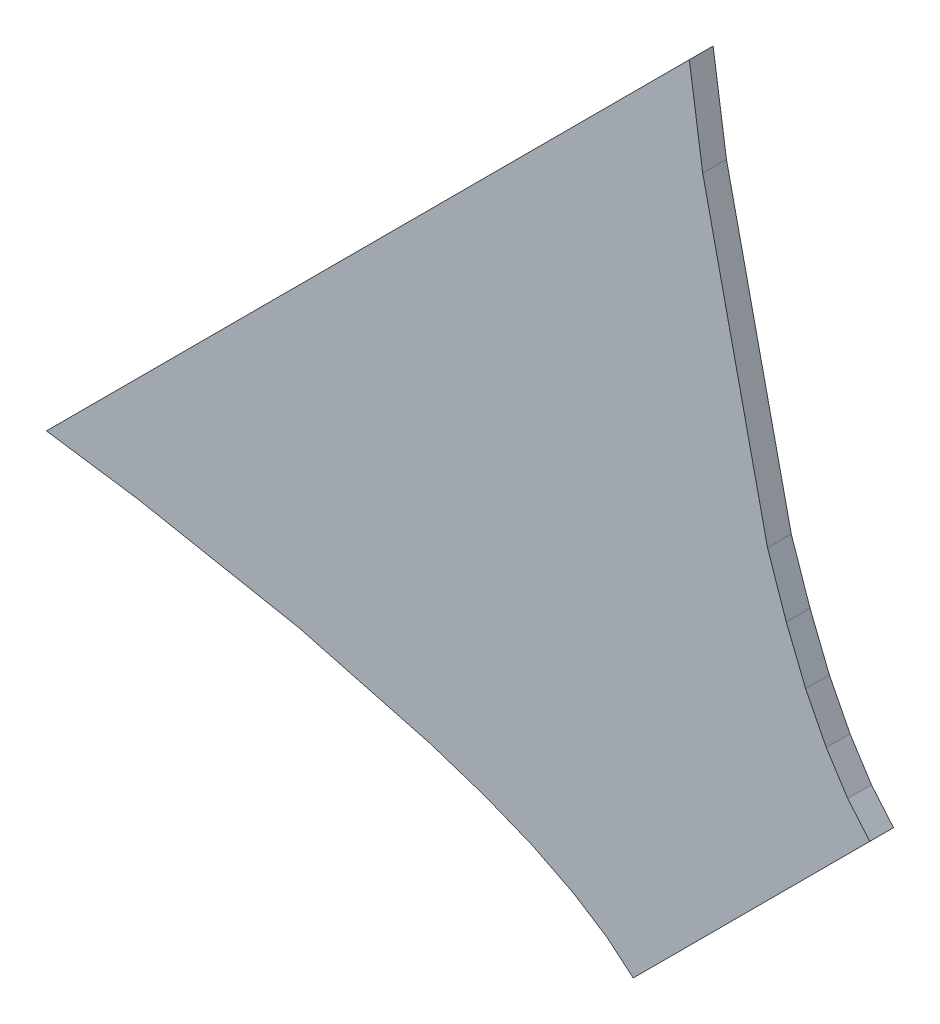
ISO-10303-21;
HEADER;
FILE_DESCRIPTION(('STEP AP214'),'2;1');
FILE_NAME('part.step','',(''),(''),'','','');
FILE_SCHEMA(('AUTOMOTIVE_DESIGN { 1 0 10303 214 1 1 1 1 }'));
ENDSEC;
DATA;
#1=APPLICATION_CONTEXT('core data for automotive mechanical design processes');
#2=APPLICATION_PROTOCOL_DEFINITION('international standard','automotive_design',2000,#1);
#3=PRODUCT_CONTEXT('',#1,'mechanical');
#4=PRODUCT('Part','Part','',(#3));
#5=PRODUCT_RELATED_PRODUCT_CATEGORY('part','',(#4));
#6=PRODUCT_DEFINITION_FORMATION('','',#4);
#7=PRODUCT_DEFINITION_CONTEXT('part definition',#1,'design');
#8=PRODUCT_DEFINITION('design','',#6,#7);
#9=PRODUCT_DEFINITION_SHAPE('','',#8);
#10=(LENGTH_UNIT() NAMED_UNIT(*) SI_UNIT(.MILLI.,.METRE.));
#11=(NAMED_UNIT(*) PLANE_ANGLE_UNIT() SI_UNIT($,.RADIAN.));
#12=(NAMED_UNIT(*) SI_UNIT($,.STERADIAN.) SOLID_ANGLE_UNIT());
#13=UNCERTAINTY_MEASURE_WITH_UNIT(LENGTH_MEASURE(1.E-05),#10,'distance_accuracy_value','');
#14=(GEOMETRIC_REPRESENTATION_CONTEXT(3) GLOBAL_UNCERTAINTY_ASSIGNED_CONTEXT((#13)) GLOBAL_UNIT_ASSIGNED_CONTEXT((#10,
#11,#12)) REPRESENTATION_CONTEXT('',''));
#15=CARTESIAN_POINT('',(0.,0.,0.));
#16=DIRECTION('',(0.,0.,1.));
#17=DIRECTION('',(1.,0.,0.));
#18=AXIS2_PLACEMENT_3D('',#15,#16,#17);
#19=CARTESIAN_POINT('',(44.5719985961914,61.8419990539551,0.));
#20=DIRECTION('',(-0.763425936268127,-0.645895378395862,0.));
#21=DIRECTION('',(-0.645895378395862,0.763425936268127,0.));
#22=AXIS2_PLACEMENT_3D('',#19,#20,#21);
#23=PLANE('',#22);
#24=DIRECTION('',(-0.645895378395862,0.763425936268127,0.));
#25=VECTOR('',#24,1.);
#26=CARTESIAN_POINT('',(44.5719985961914,61.8419990539551,0.03556));
#27=LINE('',#26,#25);
#28=CARTESIAN_POINT('',(44.5719985961914,61.8419990539551,0.03556));
#29=VERTEX_POINT('',#28);
#30=CARTESIAN_POINT('',(44.5390014648438,61.8810005187988,0.03556));
#31=VERTEX_POINT('',#30);
#32=EDGE_CURVE('E11',#29,#31,#27,.T.);
#33=ORIENTED_EDGE('',*,*,#32,.F.);
#34=DIRECTION('',(0.,0.,1.));
#35=VECTOR('',#34,1.);
#36=CARTESIAN_POINT('',(44.5719985961914,61.8419990539551,0.));
#37=LINE('',#36,#35);
#38=CARTESIAN_POINT('',(44.5719985961914,61.8419990539551,0.));
#39=VERTEX_POINT('',#38);
#40=EDGE_CURVE('E24',#39,#29,#37,.T.);
#41=ORIENTED_EDGE('',*,*,#40,.F.);
#42=DIRECTION('',(-0.645895378395862,0.763425936268127,0.));
#43=VECTOR('',#42,1.);
#44=CARTESIAN_POINT('',(44.5719985961914,61.8419990539551,0.));
#45=LINE('',#44,#43);
#46=CARTESIAN_POINT('',(44.5390014648438,61.8810005187988,0.));
#47=VERTEX_POINT('',#46);
#48=EDGE_CURVE('E154',#39,#47,#45,.T.);
#49=ORIENTED_EDGE('',*,*,#48,.T.);
#50=DIRECTION('',(0.,0.,1.));
#51=VECTOR('',#50,1.);
#52=CARTESIAN_POINT('',(44.5390014648438,61.8810005187988,0.));
#53=LINE('',#52,#51);
#54=EDGE_CURVE('E37',#47,#31,#53,.T.);
#55=ORIENTED_EDGE('',*,*,#54,.T.);
#56=EDGE_LOOP('',(#33,#41,#49,#55));
#57=FACE_BOUND('',#56,.T.);
#58=ADVANCED_FACE('F17',(#57),#23,.F.);
#59=CARTESIAN_POINT('',(44.5390014648438,61.8810005187988,0.));
#60=DIRECTION('',(-0.842256228833609,-0.53907740166973,0.));
#61=DIRECTION('',(-0.53907740166973,0.842256228833609,0.));
#62=AXIS2_PLACEMENT_3D('',#59,#60,#61);
#63=PLANE('',#62);
#64=DIRECTION('',(-0.53907740166973,0.842256228833609,0.));
#65=VECTOR('',#64,1.);
#66=CARTESIAN_POINT('',(44.5390014648438,61.8810005187988,0.03556));
#67=LINE('',#66,#65);
#68=CARTESIAN_POINT('',(44.5069999694824,61.9309997558594,0.03556));
#69=VERTEX_POINT('',#68);
#70=EDGE_CURVE('E266',#31,#69,#67,.T.);
#71=ORIENTED_EDGE('',*,*,#70,.F.);
#72=ORIENTED_EDGE('',*,*,#54,.F.);
#73=DIRECTION('',(-0.53907740166973,0.842256228833609,0.));
#74=VECTOR('',#73,1.);
#75=CARTESIAN_POINT('',(44.5390014648438,61.8810005187988,0.));
#76=LINE('',#75,#74);
#77=CARTESIAN_POINT('',(44.5069999694824,61.9309997558594,0.));
#78=VERTEX_POINT('',#77);
#79=EDGE_CURVE('E263',#47,#78,#76,.T.);
#80=ORIENTED_EDGE('',*,*,#79,.T.);
#81=DIRECTION('',(0.,0.,1.));
#82=VECTOR('',#81,1.);
#83=CARTESIAN_POINT('',(44.5069999694824,61.9309997558594,0.));
#84=LINE('',#83,#82);
#85=EDGE_CURVE('E261',#78,#69,#84,.T.);
#86=ORIENTED_EDGE('',*,*,#85,.T.);
#87=EDGE_LOOP('',(#71,#72,#80,#86));
#88=FACE_BOUND('',#87,.T.);
#89=ADVANCED_FACE('F274',(#88),#63,.F.);
#90=CARTESIAN_POINT('',(44.5069999694824,61.9309997558594,0.));
#91=DIRECTION('',(-0.891498104082583,-0.453024425850483,0.));
#92=DIRECTION('',(-0.453024425850483,0.891498104082583,0.));
#93=AXIS2_PLACEMENT_3D('',#90,#91,#92);
#94=PLANE('',#93);
#95=DIRECTION('',(-0.453024425850483,0.891498104082583,0.));
#96=VECTOR('',#95,1.);
#97=CARTESIAN_POINT('',(44.5069999694824,61.9309997558594,0.03556));
#98=LINE('',#97,#96);
#99=CARTESIAN_POINT('',(44.4760017395019,61.992000579834,0.03556));
#100=VERTEX_POINT('',#99);
#101=EDGE_CURVE('E258',#69,#100,#98,.T.);
#102=ORIENTED_EDGE('',*,*,#101,.F.);
#103=ORIENTED_EDGE('',*,*,#85,.F.);
#104=DIRECTION('',(-0.453024425850483,0.891498104082583,0.));
#105=VECTOR('',#104,1.);
#106=CARTESIAN_POINT('',(44.5069999694824,61.9309997558594,0.));
#107=LINE('',#106,#105);
#108=CARTESIAN_POINT('',(44.4760017395019,61.992000579834,0.));
#109=VERTEX_POINT('',#108);
#110=EDGE_CURVE('E255',#78,#109,#107,.T.);
#111=ORIENTED_EDGE('',*,*,#110,.T.);
#112=DIRECTION('',(0.,0.,1.));
#113=VECTOR('',#112,1.);
#114=CARTESIAN_POINT('',(44.4760017395019,61.992000579834,0.));
#115=LINE('',#114,#113);
#116=EDGE_CURVE('E253',#109,#100,#115,.T.);
#117=ORIENTED_EDGE('',*,*,#116,.T.);
#118=EDGE_LOOP('',(#102,#103,#111,#117));
#119=FACE_BOUND('',#118,.T.);
#120=ADVANCED_FACE('F280',(#119),#94,.F.);
#121=CARTESIAN_POINT('',(44.4760017395019,61.992000579834,0.));
#122=DIRECTION('',(-0.927568982596219,-0.373651953728889,0.));
#123=DIRECTION('',(-0.373651953728889,0.927568982596219,0.));
#124=AXIS2_PLACEMENT_3D('',#121,#122,#123);
#125=PLANE('',#124);
#126=DIRECTION('',(-0.373651953728889,0.927568982596219,0.));
#127=VECTOR('',#126,1.);
#128=CARTESIAN_POINT('',(44.4760017395019,61.992000579834,0.03556));
#129=LINE('',#128,#127);
#130=CARTESIAN_POINT('',(44.4469985961914,62.0639991760254,0.03556));
#131=VERTEX_POINT('',#130);
#132=EDGE_CURVE('E250',#100,#131,#129,.T.);
#133=ORIENTED_EDGE('',*,*,#132,.F.);
#134=ORIENTED_EDGE('',*,*,#116,.F.);
#135=DIRECTION('',(-0.373651953728889,0.927568982596219,0.));
#136=VECTOR('',#135,1.);
#137=CARTESIAN_POINT('',(44.4760017395019,61.992000579834,0.));
#138=LINE('',#137,#136);
#139=CARTESIAN_POINT('',(44.4469985961914,62.0639991760254,0.));
#140=VERTEX_POINT('',#139);
#141=EDGE_CURVE('E247',#109,#140,#138,.T.);
#142=ORIENTED_EDGE('',*,*,#141,.T.);
#143=DIRECTION('',(0.,0.,1.));
#144=VECTOR('',#143,1.);
#145=CARTESIAN_POINT('',(44.4469985961914,62.0639991760254,0.));
#146=LINE('',#145,#144);
#147=EDGE_CURVE('E245',#140,#131,#146,.T.);
#148=ORIENTED_EDGE('',*,*,#147,.T.);
#149=EDGE_LOOP('',(#133,#134,#142,#148));
#150=FACE_BOUND('',#149,.T.);
#151=ADVANCED_FACE('F282',(#150),#125,.F.);
#152=CARTESIAN_POINT('',(44.4469985961914,62.0639991760254,0.));
#153=DIRECTION('',(-0.946351169524934,-0.323140006713482,0.));
#154=DIRECTION('',(-0.323140006713482,0.946351169524934,0.));
#155=AXIS2_PLACEMENT_3D('',#152,#153,#154);
#156=PLANE('',#155);
#157=DIRECTION('',(-0.323140006713482,0.946351169524934,0.));
#158=VECTOR('',#157,1.);
#159=CARTESIAN_POINT('',(44.4469985961914,62.0639991760254,0.03556));
#160=LINE('',#159,#158);
#161=CARTESIAN_POINT('',(44.4189987182617,62.1459999084473,0.03556));
#162=VERTEX_POINT('',#161);
#163=EDGE_CURVE('E242',#131,#162,#160,.T.);
#164=ORIENTED_EDGE('',*,*,#163,.F.);
#165=ORIENTED_EDGE('',*,*,#147,.F.);
#166=DIRECTION('',(-0.323140006713482,0.946351169524934,0.));
#167=VECTOR('',#166,1.);
#168=CARTESIAN_POINT('',(44.4469985961914,62.0639991760254,0.));
#169=LINE('',#168,#167);
#170=CARTESIAN_POINT('',(44.4189987182617,62.1459999084473,0.));
#171=VERTEX_POINT('',#170);
#172=EDGE_CURVE('E239',#140,#171,#169,.T.);
#173=ORIENTED_EDGE('',*,*,#172,.T.);
#174=DIRECTION('',(0.,0.,1.));
#175=VECTOR('',#174,1.);
#176=CARTESIAN_POINT('',(44.4189987182617,62.1459999084473,0.));
#177=LINE('',#176,#175);
#178=EDGE_CURVE('E237',#171,#162,#177,.T.);
#179=ORIENTED_EDGE('',*,*,#178,.T.);
#180=EDGE_LOOP('',(#164,#165,#173,#179));
#181=FACE_BOUND('',#180,.T.);
#182=ADVANCED_FACE('F287',(#181),#156,.F.);
#183=CARTESIAN_POINT('',(44.4189987182617,62.1459999084473,0.));
#184=DIRECTION('',(-0.976239566364474,-0.21669404482935,0.));
#185=DIRECTION('',(-0.21669404482935,0.976239566364474,0.));
#186=AXIS2_PLACEMENT_3D('',#183,#184,#185);
#187=PLANE('',#186);
#188=DIRECTION('',(-0.21669404482935,0.976239566364474,0.));
#189=VECTOR('',#188,1.);
#190=CARTESIAN_POINT('',(44.4189987182617,62.1459999084473,0.03556));
#191=LINE('',#190,#189);
#192=CARTESIAN_POINT('',(44.3219985961914,62.5830001831055,0.03556));
#193=VERTEX_POINT('',#192);
#194=EDGE_CURVE('E234',#162,#193,#191,.T.);
#195=ORIENTED_EDGE('',*,*,#194,.F.);
#196=ORIENTED_EDGE('',*,*,#178,.F.);
#197=DIRECTION('',(-0.21669404482935,0.976239566364474,0.));
#198=VECTOR('',#197,1.);
#199=CARTESIAN_POINT('',(44.4189987182617,62.1459999084473,0.));
#200=LINE('',#199,#198);
#201=CARTESIAN_POINT('',(44.3219985961914,62.5830001831055,0.));
#202=VERTEX_POINT('',#201);
#203=EDGE_CURVE('E231',#171,#202,#200,.T.);
#204=ORIENTED_EDGE('',*,*,#203,.T.);
#205=DIRECTION('',(0.,0.,1.));
#206=VECTOR('',#205,1.);
#207=CARTESIAN_POINT('',(44.3219985961914,62.5830001831055,0.));
#208=LINE('',#207,#206);
#209=EDGE_CURVE('E229',#202,#193,#208,.T.);
#210=ORIENTED_EDGE('',*,*,#209,.T.);
#211=EDGE_LOOP('',(#195,#196,#204,#210));
#212=FACE_BOUND('',#211,.T.);
#213=ADVANCED_FACE('F290',(#212),#187,.F.);
#214=CARTESIAN_POINT('',(44.3219985961914,62.5830001831055,0.));
#215=DIRECTION('',(-0.989511166848601,-0.144456397165095,0.));
#216=DIRECTION('',(-0.144456397165095,0.989511166848601,0.));
#217=AXIS2_PLACEMENT_3D('',#214,#215,#216);
#218=PLANE('',#217);
#219=DIRECTION('',(-0.144456397165095,0.989511166848601,0.));
#220=VECTOR('',#219,1.);
#221=CARTESIAN_POINT('',(44.3219985961914,62.5830001831055,0.03556));
#222=LINE('',#221,#220);
#223=CARTESIAN_POINT('',(44.3019981384277,62.7200012207031,0.03556));
#224=VERTEX_POINT('',#223);
#225=EDGE_CURVE('E226',#193,#224,#222,.T.);
#226=ORIENTED_EDGE('',*,*,#225,.F.);
#227=ORIENTED_EDGE('',*,*,#209,.F.);
#228=DIRECTION('',(-0.144456397165095,0.989511166848601,0.));
#229=VECTOR('',#228,1.);
#230=CARTESIAN_POINT('',(44.3219985961914,62.5830001831055,0.));
#231=LINE('',#230,#229);
#232=CARTESIAN_POINT('',(44.3019981384277,62.7200012207031,0.));
#233=VERTEX_POINT('',#232);
#234=EDGE_CURVE('E223',#202,#233,#231,.T.);
#235=ORIENTED_EDGE('',*,*,#234,.T.);
#236=DIRECTION('',(0.,0.,1.));
#237=VECTOR('',#236,1.);
#238=CARTESIAN_POINT('',(44.3019981384277,62.7200012207031,0.));
#239=LINE('',#238,#237);
#240=EDGE_CURVE('E221',#233,#224,#239,.T.);
#241=ORIENTED_EDGE('',*,*,#240,.T.);
#242=EDGE_LOOP('',(#226,#227,#235,#241));
#243=FACE_BOUND('',#242,.T.);
#244=ADVANCED_FACE('F295',(#243),#218,.F.);
#245=CARTESIAN_POINT('',(44.3019981384277,62.7200012207031,0.));
#246=DIRECTION('',(0.707108183159484,-0.707105379210831,0.));
#247=DIRECTION('',(-0.707105379210831,-0.707108183159484,0.));
#248=AXIS2_PLACEMENT_3D('',#245,#246,#247);
#249=PLANE('',#248);
#250=DIRECTION('',(-0.707105379210831,-0.707108183159484,0.));
#251=VECTOR('',#250,1.);
#252=CARTESIAN_POINT('',(44.3019981384277,62.7200012207031,0.03556));
#253=LINE('',#252,#251);
#254=CARTESIAN_POINT('',(43.3400001525879,61.757999420166,0.03556));
#255=VERTEX_POINT('',#254);
#256=EDGE_CURVE('E218',#224,#255,#253,.T.);
#257=ORIENTED_EDGE('',*,*,#256,.F.);
#258=ORIENTED_EDGE('',*,*,#240,.F.);
#259=DIRECTION('',(-0.707105379210831,-0.707108183159484,0.));
#260=VECTOR('',#259,1.);
#261=CARTESIAN_POINT('',(44.3019981384277,62.7200012207031,0.));
#262=LINE('',#261,#260);
#263=CARTESIAN_POINT('',(43.3400001525879,61.757999420166,0.));
#264=VERTEX_POINT('',#263);
#265=EDGE_CURVE('E215',#233,#264,#262,.T.);
#266=ORIENTED_EDGE('',*,*,#265,.T.);
#267=DIRECTION('',(0.,0.,1.));
#268=VECTOR('',#267,1.);
#269=CARTESIAN_POINT('',(43.3400001525879,61.757999420166,0.));
#270=LINE('',#269,#268);
#271=EDGE_CURVE('E213',#264,#255,#270,.T.);
#272=ORIENTED_EDGE('',*,*,#271,.T.);
#273=EDGE_LOOP('',(#257,#258,#266,#272));
#274=FACE_BOUND('',#273,.T.);
#275=ADVANCED_FACE('F298',(#274),#249,.F.);
#276=CARTESIAN_POINT('',(43.3400001525879,61.757999420166,0.));
#277=DIRECTION('',(0.144456397165095,0.989511166848601,0.));
#278=DIRECTION('',(0.989511166848601,-0.144456397165095,0.));
#279=AXIS2_PLACEMENT_3D('',#276,#277,#278);
#280=PLANE('',#279);
#281=DIRECTION('',(0.989511166848601,-0.144456397165095,0.));
#282=VECTOR('',#281,1.);
#283=CARTESIAN_POINT('',(43.3400001525879,61.757999420166,0.03556));
#284=LINE('',#283,#282);
#285=CARTESIAN_POINT('',(43.4770011901855,61.7379989624023,0.03556));
#286=VERTEX_POINT('',#285);
#287=EDGE_CURVE('E210',#255,#286,#284,.T.);
#288=ORIENTED_EDGE('',*,*,#287,.F.);
#289=ORIENTED_EDGE('',*,*,#271,.F.);
#290=DIRECTION('',(0.989511166848601,-0.144456397165095,0.));
#291=VECTOR('',#290,1.);
#292=CARTESIAN_POINT('',(43.3400001525879,61.757999420166,0.));
#293=LINE('',#292,#291);
#294=CARTESIAN_POINT('',(43.4770011901855,61.7379989624023,0.));
#295=VERTEX_POINT('',#294);
#296=EDGE_CURVE('E207',#264,#295,#293,.T.);
#297=ORIENTED_EDGE('',*,*,#296,.T.);
#298=DIRECTION('',(0.,0.,1.));
#299=VECTOR('',#298,1.);
#300=CARTESIAN_POINT('',(43.4770011901855,61.7379989624023,0.));
#301=LINE('',#300,#299);
#302=EDGE_CURVE('E205',#295,#286,#301,.T.);
#303=ORIENTED_EDGE('',*,*,#302,.T.);
#304=EDGE_LOOP('',(#288,#289,#297,#303));
#305=FACE_BOUND('',#304,.T.);
#306=ADVANCED_FACE('F303',(#305),#280,.F.);
#307=CARTESIAN_POINT('',(43.4770011901855,61.7379989624024,0.));
#308=DIRECTION('',(0.188232464271572,0.982124503000639,0.));
#309=DIRECTION('',(0.982124503000639,-0.188232464271572,0.));
#310=AXIS2_PLACEMENT_3D('',#307,#308,#309);
#311=PLANE('',#310);
#312=DIRECTION('',(0.982124503000638,-0.188232464271572,0.));
#313=VECTOR('',#312,1.);
#314=CARTESIAN_POINT('',(43.4770011901855,61.7379989624023,0.03556));
#315=LINE('',#314,#313);
#316=CARTESIAN_POINT('',(43.7169990539551,61.6920013427734,0.03556));
#317=VERTEX_POINT('',#316);
#318=EDGE_CURVE('E202',#286,#317,#315,.T.);
#319=ORIENTED_EDGE('',*,*,#318,.F.);
#320=ORIENTED_EDGE('',*,*,#302,.F.);
#321=DIRECTION('',(0.982124503000638,-0.188232464271572,0.));
#322=VECTOR('',#321,1.);
#323=CARTESIAN_POINT('',(43.4770011901855,61.7379989624023,0.));
#324=LINE('',#323,#322);
#325=CARTESIAN_POINT('',(43.7169990539551,61.6920013427734,0.));
#326=VERTEX_POINT('',#325);
#327=EDGE_CURVE('E199',#295,#326,#324,.T.);
#328=ORIENTED_EDGE('',*,*,#327,.T.);
#329=DIRECTION('',(0.,0.,1.));
#330=VECTOR('',#329,1.);
#331=CARTESIAN_POINT('',(43.7169990539551,61.6920013427734,0.));
#332=LINE('',#331,#330);
#333=EDGE_CURVE('E197',#326,#317,#332,.T.);
#334=ORIENTED_EDGE('',*,*,#333,.T.);
#335=EDGE_LOOP('',(#319,#320,#328,#334));
#336=FACE_BOUND('',#335,.T.);
#337=ADVANCED_FACE('F306',(#336),#311,.F.);
#338=CARTESIAN_POINT('',(43.7169990539551,61.6920013427734,0.));
#339=DIRECTION('',(0.255224031547803,0.966881944045128,0.));
#340=DIRECTION('',(0.966881944045128,-0.255224031547803,0.));
#341=AXIS2_PLACEMENT_3D('',#338,#339,#340);
#342=PLANE('',#341);
#343=DIRECTION('',(0.966881944045128,-0.255224031547803,0.));
#344=VECTOR('',#343,1.);
#345=CARTESIAN_POINT('',(43.7169990539551,61.6920013427734,0.03556));
#346=LINE('',#345,#344);
#347=CARTESIAN_POINT('',(43.9140014648438,61.6399993896484,0.03556));
#348=VERTEX_POINT('',#347);
#349=EDGE_CURVE('E194',#317,#348,#346,.T.);
#350=ORIENTED_EDGE('',*,*,#349,.F.);
#351=ORIENTED_EDGE('',*,*,#333,.F.);
#352=DIRECTION('',(0.966881944045128,-0.255224031547803,0.));
#353=VECTOR('',#352,1.);
#354=CARTESIAN_POINT('',(43.7169990539551,61.6920013427734,0.));
#355=LINE('',#354,#353);
#356=CARTESIAN_POINT('',(43.9140014648438,61.6399993896484,0.));
#357=VERTEX_POINT('',#356);
#358=EDGE_CURVE('E191',#326,#357,#355,.T.);
#359=ORIENTED_EDGE('',*,*,#358,.T.);
#360=DIRECTION('',(0.,0.,1.));
#361=VECTOR('',#360,1.);
#362=CARTESIAN_POINT('',(43.9140014648438,61.6399993896484,0.));
#363=LINE('',#362,#361);
#364=EDGE_CURVE('E189',#357,#348,#363,.T.);
#365=ORIENTED_EDGE('',*,*,#364,.T.);
#366=EDGE_LOOP('',(#350,#351,#359,#365));
#367=FACE_BOUND('',#366,.T.);
#368=ADVANCED_FACE('F311',(#367),#342,.F.);
#369=CARTESIAN_POINT('',(43.9140014648438,61.6399993896484,0.));
#370=DIRECTION('',(0.312765708787135,0.949830306637392,0.));
#371=DIRECTION('',(0.949830306637392,-0.312765708787135,0.));
#372=AXIS2_PLACEMENT_3D('',#369,#370,#371);
#373=PLANE('',#372);
#374=DIRECTION('',(0.949830306637391,-0.312765708787135,0.));
#375=VECTOR('',#374,1.);
#376=CARTESIAN_POINT('',(43.9140014648438,61.6399993896484,0.03556));
#377=LINE('',#376,#375);
#378=CARTESIAN_POINT('',(43.9959983825684,61.6129989624023,0.03556));
#379=VERTEX_POINT('',#378);
#380=EDGE_CURVE('E186',#348,#379,#377,.T.);
#381=ORIENTED_EDGE('',*,*,#380,.F.);
#382=ORIENTED_EDGE('',*,*,#364,.F.);
#383=DIRECTION('',(0.949830306637391,-0.312765708787135,0.));
#384=VECTOR('',#383,1.);
#385=CARTESIAN_POINT('',(43.9140014648438,61.6399993896484,0.));
#386=LINE('',#385,#384);
#387=CARTESIAN_POINT('',(43.9959983825684,61.6129989624023,0.));
#388=VERTEX_POINT('',#387);
#389=EDGE_CURVE('E183',#357,#388,#386,.T.);
#390=ORIENTED_EDGE('',*,*,#389,.T.);
#391=DIRECTION('',(0.,0.,1.));
#392=VECTOR('',#391,1.);
#393=CARTESIAN_POINT('',(43.9959983825684,61.6129989624023,0.));
#394=LINE('',#393,#392);
#395=EDGE_CURVE('E181',#388,#379,#394,.T.);
#396=ORIENTED_EDGE('',*,*,#395,.T.);
#397=EDGE_LOOP('',(#381,#382,#390,#396));
#398=FACE_BOUND('',#397,.T.);
#399=ADVANCED_FACE('F314',(#398),#373,.F.);
#400=CARTESIAN_POINT('',(43.9959983825684,61.6129989624024,0.));
#401=DIRECTION('',(0.373592637532109,0.927592874693312,0.));
#402=DIRECTION('',(0.927592874693312,-0.373592637532109,0.));
#403=AXIS2_PLACEMENT_3D('',#400,#401,#402);
#404=PLANE('',#403);
#405=DIRECTION('',(0.927592874693312,-0.373592637532109,0.));
#406=VECTOR('',#405,1.);
#407=CARTESIAN_POINT('',(43.9959983825684,61.6129989624023,0.03556));
#408=LINE('',#407,#406);
#409=CARTESIAN_POINT('',(44.068000793457,61.5839996337891,0.03556));
#410=VERTEX_POINT('',#409);
#411=EDGE_CURVE('E178',#379,#410,#408,.T.);
#412=ORIENTED_EDGE('',*,*,#411,.F.);
#413=ORIENTED_EDGE('',*,*,#395,.F.);
#414=DIRECTION('',(0.927592874693312,-0.373592637532109,0.));
#415=VECTOR('',#414,1.);
#416=CARTESIAN_POINT('',(43.9959983825684,61.6129989624023,0.));
#417=LINE('',#416,#415);
#418=CARTESIAN_POINT('',(44.068000793457,61.5839996337891,0.));
#419=VERTEX_POINT('',#418);
#420=EDGE_CURVE('E175',#388,#419,#417,.T.);
#421=ORIENTED_EDGE('',*,*,#420,.T.);
#422=DIRECTION('',(0.,0.,1.));
#423=VECTOR('',#422,1.);
#424=CARTESIAN_POINT('',(44.068000793457,61.5839996337891,0.));
#425=LINE('',#424,#423);
#426=EDGE_CURVE('E173',#419,#410,#425,.T.);
#427=ORIENTED_EDGE('',*,*,#426,.T.);
#428=EDGE_LOOP('',(#412,#413,#421,#427));
#429=FACE_BOUND('',#428,.T.);
#430=ADVANCED_FACE('F319',(#429),#404,.F.);
#431=CARTESIAN_POINT('',(44.068000793457,61.5839996337891,0.));
#432=DIRECTION('',(0.453024425850483,0.891498104082583,0.));
#433=DIRECTION('',(0.891498104082583,-0.453024425850483,0.));
#434=AXIS2_PLACEMENT_3D('',#431,#432,#433);
#435=PLANE('',#434);
#436=DIRECTION('',(0.891498104082583,-0.453024425850483,0.));
#437=VECTOR('',#436,1.);
#438=CARTESIAN_POINT('',(44.068000793457,61.5839996337891,0.03556));
#439=LINE('',#438,#437);
#440=CARTESIAN_POINT('',(44.1290016174316,61.5530014038086,0.03556));
#441=VERTEX_POINT('',#440);
#442=EDGE_CURVE('E170',#410,#441,#439,.T.);
#443=ORIENTED_EDGE('',*,*,#442,.F.);
#444=ORIENTED_EDGE('',*,*,#426,.F.);
#445=DIRECTION('',(0.891498104082583,-0.453024425850483,0.));
#446=VECTOR('',#445,1.);
#447=CARTESIAN_POINT('',(44.068000793457,61.5839996337891,0.));
#448=LINE('',#447,#446);
#449=CARTESIAN_POINT('',(44.1290016174316,61.5530014038086,0.));
#450=VERTEX_POINT('',#449);
#451=EDGE_CURVE('E167',#419,#450,#448,.T.);
#452=ORIENTED_EDGE('',*,*,#451,.T.);
#453=DIRECTION('',(0.,0.,1.));
#454=VECTOR('',#453,1.);
#455=CARTESIAN_POINT('',(44.1290016174316,61.5530014038086,0.));
#456=LINE('',#455,#454);
#457=EDGE_CURVE('E165',#450,#441,#456,.T.);
#458=ORIENTED_EDGE('',*,*,#457,.T.);
#459=EDGE_LOOP('',(#443,#444,#452,#458));
#460=FACE_BOUND('',#459,.T.);
#461=ADVANCED_FACE('F322',(#460),#435,.F.);
#462=CARTESIAN_POINT('',(44.1290016174316,61.5530014038086,0.));
#463=DIRECTION('',(0.53907740166973,0.842256228833609,0.));
#464=DIRECTION('',(0.842256228833609,-0.53907740166973,0.));
#465=AXIS2_PLACEMENT_3D('',#462,#463,#464);
#466=PLANE('',#465);
#467=DIRECTION('',(0.842256228833609,-0.53907740166973,0.));
#468=VECTOR('',#467,1.);
#469=CARTESIAN_POINT('',(44.1290016174316,61.5530014038086,0.03556));
#470=LINE('',#469,#468);
#471=CARTESIAN_POINT('',(44.1790008544922,61.5209999084473,0.03556));
#472=VERTEX_POINT('',#471);
#473=EDGE_CURVE('E162',#441,#472,#470,.T.);
#474=ORIENTED_EDGE('',*,*,#473,.F.);
#475=ORIENTED_EDGE('',*,*,#457,.F.);
#476=DIRECTION('',(0.842256228833609,-0.53907740166973,0.));
#477=VECTOR('',#476,1.);
#478=CARTESIAN_POINT('',(44.1290016174316,61.5530014038086,0.));
#479=LINE('',#478,#477);
#480=CARTESIAN_POINT('',(44.1790008544922,61.5209999084473,0.));
#481=VERTEX_POINT('',#480);
#482=EDGE_CURVE('E160',#450,#481,#479,.T.);
#483=ORIENTED_EDGE('',*,*,#482,.T.);
#484=DIRECTION('',(0.,0.,1.));
#485=VECTOR('',#484,1.);
#486=CARTESIAN_POINT('',(44.1790008544922,61.5209999084473,0.));
#487=LINE('',#486,#485);
#488=EDGE_CURVE('E145',#481,#472,#487,.T.);
#489=ORIENTED_EDGE('',*,*,#488,.T.);
#490=EDGE_LOOP('',(#474,#475,#483,#489));
#491=FACE_BOUND('',#490,.T.);
#492=ADVANCED_FACE('F325',(#491),#466,.F.);
#493=CARTESIAN_POINT('',(44.1790008544922,61.5209999084473,0.));
#494=DIRECTION('',(0.645975713891104,0.763357961288725,0.));
#495=DIRECTION('',(0.763357961288725,-0.645975713891104,0.));
#496=AXIS2_PLACEMENT_3D('',#493,#494,#495);
#497=PLANE('',#496);
#498=DIRECTION('',(0.763357961288725,-0.645975713891104,0.));
#499=VECTOR('',#498,1.);
#500=CARTESIAN_POINT('',(44.1790008544922,61.5209999084473,0.03556));
#501=LINE('',#500,#499);
#502=CARTESIAN_POINT('',(44.2179985046387,61.4879989624023,0.03556));
#503=VERTEX_POINT('',#502);
#504=EDGE_CURVE('E149',#472,#503,#501,.T.);
#505=ORIENTED_EDGE('',*,*,#504,.F.);
#506=ORIENTED_EDGE('',*,*,#488,.F.);
#507=DIRECTION('',(0.763357961288725,-0.645975713891104,0.));
#508=VECTOR('',#507,1.);
#509=CARTESIAN_POINT('',(44.1790008544922,61.5209999084473,0.));
#510=LINE('',#509,#508);
#511=CARTESIAN_POINT('',(44.2179985046387,61.4879989624023,0.));
#512=VERTEX_POINT('',#511);
#513=EDGE_CURVE('E141',#481,#512,#510,.T.);
#514=ORIENTED_EDGE('',*,*,#513,.T.);
#515=DIRECTION('',(0.,0.,1.));
#516=VECTOR('',#515,1.);
#517=CARTESIAN_POINT('',(44.2179985046387,61.4879989624023,0.));
#518=LINE('',#517,#516);
#519=EDGE_CURVE('E131',#512,#503,#518,.T.);
#520=ORIENTED_EDGE('',*,*,#519,.T.);
#521=EDGE_LOOP('',(#505,#506,#514,#520));
#522=FACE_BOUND('',#521,.T.);
#523=ADVANCED_FACE('F144',(#522),#497,.F.);
#524=CARTESIAN_POINT('',(44.2179985046387,61.4879989624024,0.));
#525=DIRECTION('',(-0.707106781186548,0.707106781186548,0.));
#526=DIRECTION('',(0.707106781186548,0.707106781186548,0.));
#527=AXIS2_PLACEMENT_3D('',#524,#525,#526);
#528=PLANE('',#527);
#529=DIRECTION('',(0.707106781186548,0.707106781186548,0.));
#530=VECTOR('',#529,1.);
#531=CARTESIAN_POINT('',(44.2179985046387,61.4879989624023,0.03556));
#532=LINE('',#531,#530);
#533=EDGE_CURVE('E137',#503,#29,#532,.T.);
#534=ORIENTED_EDGE('',*,*,#533,.F.);
#535=ORIENTED_EDGE('',*,*,#519,.F.);
#536=DIRECTION('',(0.707106781186548,0.707106781186548,0.));
#537=VECTOR('',#536,1.);
#538=CARTESIAN_POINT('',(44.2179985046387,61.4879989624023,0.));
#539=LINE('',#538,#537);
#540=EDGE_CURVE('E135',#512,#39,#539,.T.);
#541=ORIENTED_EDGE('',*,*,#540,.T.);
#542=ORIENTED_EDGE('',*,*,#40,.T.);
#543=EDGE_LOOP('',(#534,#535,#541,#542));
#544=FACE_BOUND('',#543,.T.);
#545=ADVANCED_FACE('F133',(#544),#528,.F.);
#546=CARTESIAN_POINT('',(44.5719985961914,61.8419990539551,0.));
#547=DIRECTION('',(0.,0.,1.));
#548=DIRECTION('',(1.,0.,0.));
#549=AXIS2_PLACEMENT_3D('',#546,#547,#548);
#550=PLANE('',#549);
#551=ORIENTED_EDGE('',*,*,#540,.F.);
#552=ORIENTED_EDGE('',*,*,#513,.F.);
#553=ORIENTED_EDGE('',*,*,#482,.F.);
#554=ORIENTED_EDGE('',*,*,#451,.F.);
#555=ORIENTED_EDGE('',*,*,#420,.F.);
#556=ORIENTED_EDGE('',*,*,#389,.F.);
#557=ORIENTED_EDGE('',*,*,#358,.F.);
#558=ORIENTED_EDGE('',*,*,#327,.F.);
#559=ORIENTED_EDGE('',*,*,#296,.F.);
#560=ORIENTED_EDGE('',*,*,#265,.F.);
#561=ORIENTED_EDGE('',*,*,#234,.F.);
#562=ORIENTED_EDGE('',*,*,#203,.F.);
#563=ORIENTED_EDGE('',*,*,#172,.F.);
#564=ORIENTED_EDGE('',*,*,#141,.F.);
#565=ORIENTED_EDGE('',*,*,#110,.F.);
#566=ORIENTED_EDGE('',*,*,#79,.F.);
#567=ORIENTED_EDGE('',*,*,#48,.F.);
#568=EDGE_LOOP('',(#551,#552,#553,#554,#555,#556,#557,#558,#559,#560,#561,#562,#563,#564,#565,
#566,#567));
#569=FACE_BOUND('',#568,.T.);
#570=ADVANCED_FACE('F152',(#569),#550,.F.);
#571=CARTESIAN_POINT('',(44.5719985961914,61.8419990539551,0.03556));
#572=DIRECTION('',(0.,0.,1.));
#573=DIRECTION('',(1.,0.,0.));
#574=AXIS2_PLACEMENT_3D('',#571,#572,#573);
#575=PLANE('',#574);
#576=ORIENTED_EDGE('',*,*,#32,.T.);
#577=ORIENTED_EDGE('',*,*,#70,.T.);
#578=ORIENTED_EDGE('',*,*,#101,.T.);
#579=ORIENTED_EDGE('',*,*,#132,.T.);
#580=ORIENTED_EDGE('',*,*,#163,.T.);
#581=ORIENTED_EDGE('',*,*,#194,.T.);
#582=ORIENTED_EDGE('',*,*,#225,.T.);
#583=ORIENTED_EDGE('',*,*,#256,.T.);
#584=ORIENTED_EDGE('',*,*,#287,.T.);
#585=ORIENTED_EDGE('',*,*,#318,.T.);
#586=ORIENTED_EDGE('',*,*,#349,.T.);
#587=ORIENTED_EDGE('',*,*,#380,.T.);
#588=ORIENTED_EDGE('',*,*,#411,.T.);
#589=ORIENTED_EDGE('',*,*,#442,.T.);
#590=ORIENTED_EDGE('',*,*,#473,.T.);
#591=ORIENTED_EDGE('',*,*,#504,.T.);
#592=ORIENTED_EDGE('',*,*,#533,.T.);
#593=EDGE_LOOP('',(#576,#577,#578,#579,#580,#581,#582,#583,#584,#585,#586,#587,#588,#589,#590,
#591,#592));
#594=FACE_BOUND('',#593,.T.);
#595=ADVANCED_FACE('F277',(#594),#575,.T.);
#596=CLOSED_SHELL('',(#58,#89,#120,#151,#182,#213,#244,#275,#306,#337,#368,#399,#430,#461,#492,
#523,#545,#570,#595));
#597=MANIFOLD_SOLID_BREP('B1',#596);
#598=ADVANCED_BREP_SHAPE_REPRESENTATION('',(#18,#597),#14);
#599=SHAPE_DEFINITION_REPRESENTATION(#9,#598);
ENDSEC;
END-ISO-10303-21;
